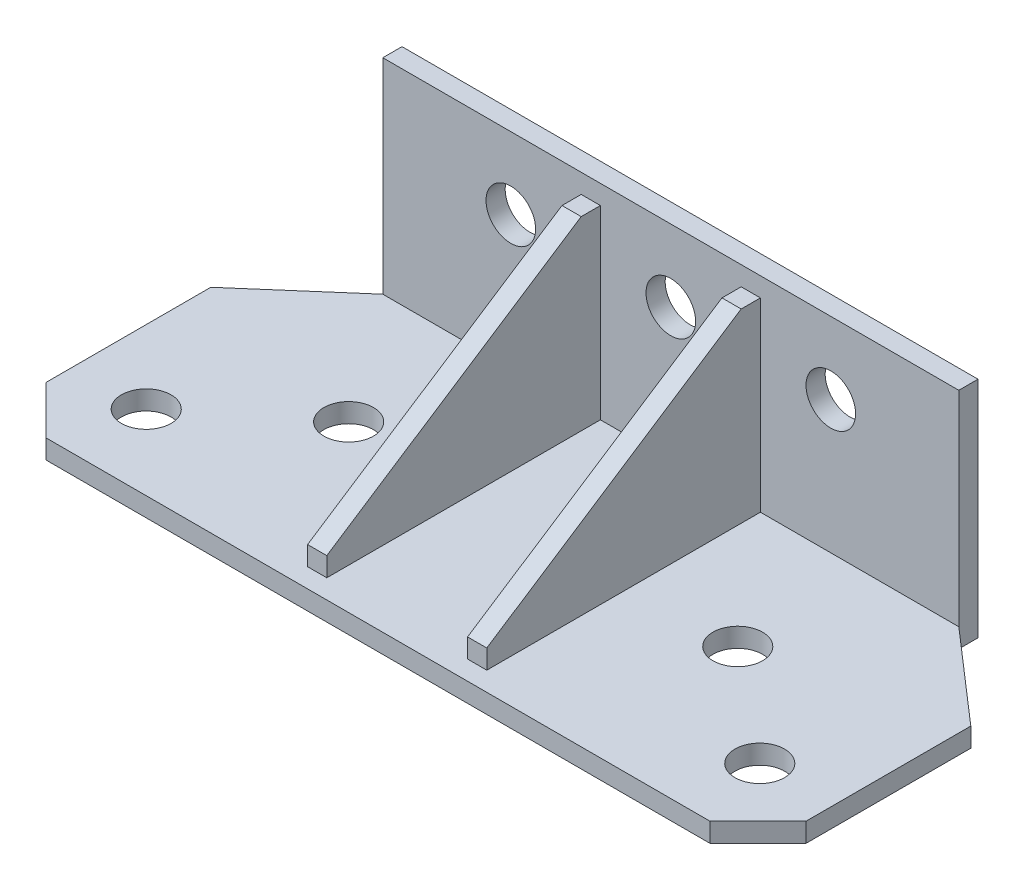
ISO-10303-21;
HEADER;
FILE_DESCRIPTION(('STEP AP214'),'2;1');
FILE_NAME('part.step','',(''),(''),'','','');
FILE_SCHEMA(('AUTOMOTIVE_DESIGN { 1 0 10303 214 1 1 1 1 }'));
ENDSEC;
DATA;
#1=APPLICATION_CONTEXT('core data for automotive mechanical design processes');
#2=APPLICATION_PROTOCOL_DEFINITION('international standard','automotive_design',2000,#1);
#3=PRODUCT_CONTEXT('',#1,'mechanical');
#4=PRODUCT('Part','Part','',(#3));
#5=PRODUCT_RELATED_PRODUCT_CATEGORY('part','',(#4));
#6=PRODUCT_DEFINITION_FORMATION('','',#4);
#7=PRODUCT_DEFINITION_CONTEXT('part definition',#1,'design');
#8=PRODUCT_DEFINITION('design','',#6,#7);
#9=PRODUCT_DEFINITION_SHAPE('','',#8);
#10=(LENGTH_UNIT() NAMED_UNIT(*) SI_UNIT(.MILLI.,.METRE.));
#11=(NAMED_UNIT(*) PLANE_ANGLE_UNIT() SI_UNIT($,.RADIAN.));
#12=(NAMED_UNIT(*) SI_UNIT($,.STERADIAN.) SOLID_ANGLE_UNIT());
#13=UNCERTAINTY_MEASURE_WITH_UNIT(LENGTH_MEASURE(1.E-05),#10,'distance_accuracy_value','');
#14=(GEOMETRIC_REPRESENTATION_CONTEXT(3) GLOBAL_UNCERTAINTY_ASSIGNED_CONTEXT((#13)) GLOBAL_UNIT_ASSIGNED_CONTEXT((#10,
#11,#12)) REPRESENTATION_CONTEXT('',''));
#15=CARTESIAN_POINT('',(0.,0.,0.));
#16=DIRECTION('',(0.,0.,1.));
#17=DIRECTION('',(1.,0.,0.));
#18=AXIS2_PLACEMENT_3D('',#15,#16,#17);
#19=CARTESIAN_POINT('',(-57.5,12.,195.));
#20=DIRECTION('',(0.,-1.,0.));
#21=DIRECTION('',(0.,0.,-1.));
#22=AXIS2_PLACEMENT_3D('',#19,#20,#21);
#23=PLANE('',#22);
#24=CARTESIAN_POINT('',(371.732317868824,12.,148.125657450823));
#25=DIRECTION('',(0.,1.,0.));
#26=DIRECTION('',(0.,0.,1.));
#27=AXIS2_PLACEMENT_3D('',#24,#25,#26);
#28=CIRCLE('',#27,15.5);
#29=CARTESIAN_POINT('',(371.732317868824,12.,163.625657450823));
#30=VERTEX_POINT('',#29);
#31=EDGE_CURVE('E209',#30,#30,#28,.T.);
#32=ORIENTED_EDGE('',*,*,#31,.F.);
#33=EDGE_LOOP('',(#32));
#34=FACE_BOUND('',#33,.T.);
#35=CARTESIAN_POINT('',(301.586347916815,12.,91.7382217980828));
#36=DIRECTION('',(0.,1.,0.));
#37=DIRECTION('',(0.,0.,1.));
#38=AXIS2_PLACEMENT_3D('',#35,#36,#37);
#39=CIRCLE('',#38,15.5);
#40=CARTESIAN_POINT('',(301.586347916815,12.,107.238221798083));
#41=VERTEX_POINT('',#40);
#42=EDGE_CURVE('E215',#41,#41,#39,.T.);
#43=ORIENTED_EDGE('',*,*,#42,.F.);
#44=EDGE_LOOP('',(#43));
#45=FACE_BOUND('',#44,.T.);
#46=CARTESIAN_POINT('',(58.4136520831852,12.,91.7382217980828));
#47=DIRECTION('',(0.,1.,0.));
#48=DIRECTION('',(0.,0.,1.));
#49=AXIS2_PLACEMENT_3D('',#46,#47,#48);
#50=CIRCLE('',#49,15.5);
#51=CARTESIAN_POINT('',(58.4136520831852,12.,107.238221798083));
#52=VERTEX_POINT('',#51);
#53=EDGE_CURVE('E227',#52,#52,#50,.F.);
#54=ORIENTED_EDGE('',*,*,#53,.T.);
#55=EDGE_LOOP('',(#54));
#56=FACE_BOUND('',#55,.T.);
#57=CARTESIAN_POINT('',(-11.7323178688235,12.,148.125657450823));
#58=DIRECTION('',(0.,1.,0.));
#59=DIRECTION('',(0.,0.,1.));
#60=AXIS2_PLACEMENT_3D('',#57,#58,#59);
#61=CIRCLE('',#60,15.5);
#62=CARTESIAN_POINT('',(-11.7323178688235,12.,163.625657450823));
#63=VERTEX_POINT('',#62);
#64=EDGE_CURVE('E221',#63,#63,#61,.F.);
#65=ORIENTED_EDGE('',*,*,#64,.T.);
#66=EDGE_LOOP('',(#65));
#67=FACE_BOUND('',#66,.T.);
#68=DIRECTION('',(0.,0.,-1.));
#69=VECTOR('',#68,1.);
#70=CARTESIAN_POINT('',(236.,11.9999999999999,183.));
#71=LINE('',#70,#69);
#72=CARTESIAN_POINT('',(236.,12.,183.));
#73=VERTEX_POINT('',#72);
#74=CARTESIAN_POINT('',(236.,12.,12.));
#75=VERTEX_POINT('',#74);
#76=EDGE_CURVE('E419',#73,#75,#71,.T.);
#77=ORIENTED_EDGE('',*,*,#76,.F.);
#78=DIRECTION('',(1.,0.,0.));
#79=VECTOR('',#78,1.);
#80=CARTESIAN_POINT('',(236.,11.9999999999999,183.));
#81=LINE('',#80,#79);
#82=CARTESIAN_POINT('',(224.,12.,183.));
#83=VERTEX_POINT('',#82);
#84=EDGE_CURVE('E413',#83,#73,#81,.T.);
#85=ORIENTED_EDGE('',*,*,#84,.F.);
#86=DIRECTION('',(0.,0.,-1.));
#87=VECTOR('',#86,1.);
#88=CARTESIAN_POINT('',(224.,12.,183.));
#89=LINE('',#88,#87);
#90=CARTESIAN_POINT('',(224.,12.,12.));
#91=VERTEX_POINT('',#90);
#92=EDGE_CURVE('E421',#83,#91,#89,.T.);
#93=ORIENTED_EDGE('',*,*,#92,.T.);
#94=DIRECTION('',(-1.,0.,0.));
#95=VECTOR('',#94,1.);
#96=CARTESIAN_POINT('',(-57.5,12.,12.));
#97=LINE('',#96,#95);
#98=CARTESIAN_POINT('',(136.,12.,12.));
#99=VERTEX_POINT('',#98);
#100=EDGE_CURVE('E275',#91,#99,#97,.T.);
#101=ORIENTED_EDGE('',*,*,#100,.T.);
#102=DIRECTION('',(0.,0.,-1.));
#103=VECTOR('',#102,1.);
#104=CARTESIAN_POINT('',(136.,12.,183.));
#105=LINE('',#104,#103);
#106=CARTESIAN_POINT('',(136.,12.,183.));
#107=VERTEX_POINT('',#106);
#108=EDGE_CURVE('E197',#107,#99,#105,.T.);
#109=ORIENTED_EDGE('',*,*,#108,.F.);
#110=DIRECTION('',(1.,0.,0.));
#111=VECTOR('',#110,1.);
#112=CARTESIAN_POINT('',(124.,12.,183.));
#113=LINE('',#112,#111);
#114=CARTESIAN_POINT('',(124.,12.,183.));
#115=VERTEX_POINT('',#114);
#116=EDGE_CURVE('E200',#115,#107,#113,.T.);
#117=ORIENTED_EDGE('',*,*,#116,.F.);
#118=DIRECTION('',(0.,0.,-1.));
#119=VECTOR('',#118,1.);
#120=CARTESIAN_POINT('',(124.,12.,183.));
#121=LINE('',#120,#119);
#122=CARTESIAN_POINT('',(124.,12.,12.));
#123=VERTEX_POINT('',#122);
#124=EDGE_CURVE('E207',#115,#123,#121,.T.);
#125=ORIENTED_EDGE('',*,*,#124,.T.);
#126=CARTESIAN_POINT('',(0.,12.,12.));
#127=VERTEX_POINT('',#126);
#128=EDGE_CURVE('E276',#123,#127,#97,.T.);
#129=ORIENTED_EDGE('',*,*,#128,.T.);
#130=DIRECTION('',(0.754605522163505,0.,-0.656178714924787));
#131=VECTOR('',#130,1.);
#132=CARTESIAN_POINT('',(5.94187298170075,12.,6.83315392895587));
#133=LINE('',#132,#131);
#134=CARTESIAN_POINT('',(-57.5,12.,62.));
#135=VERTEX_POINT('',#134);
#136=EDGE_CURVE('E233',#135,#127,#133,.T.);
#137=ORIENTED_EDGE('',*,*,#136,.F.);
#138=DIRECTION('',(0.,0.,-1.));
#139=VECTOR('',#138,1.);
#140=CARTESIAN_POINT('',(-57.5,12.,195.));
#141=LINE('',#140,#139);
#142=CARTESIAN_POINT('',(-57.5,12.,165.));
#143=VERTEX_POINT('',#142);
#144=EDGE_CURVE('E270',#143,#135,#141,.T.);
#145=ORIENTED_EDGE('',*,*,#144,.F.);
#146=DIRECTION('',(-0.707106781186548,0.,-0.707106781186548));
#147=VECTOR('',#146,1.);
#148=CARTESIAN_POINT('',(-111.25,12.,111.25));
#149=LINE('',#148,#147);
#150=CARTESIAN_POINT('',(-27.5,12.,195.));
#151=VERTEX_POINT('',#150);
#152=EDGE_CURVE('E239',#151,#143,#149,.T.);
#153=ORIENTED_EDGE('',*,*,#152,.F.);
#154=DIRECTION('',(-1.,0.,0.));
#155=VECTOR('',#154,1.);
#156=CARTESIAN_POINT('',(-57.5,12.,195.));
#157=LINE('',#156,#155);
#158=CARTESIAN_POINT('',(387.5,12.,195.));
#159=VERTEX_POINT('',#158);
#160=EDGE_CURVE('E267',#159,#151,#157,.T.);
#161=ORIENTED_EDGE('',*,*,#160,.F.);
#162=DIRECTION('',(0.707106781186548,0.,-0.707106781186547));
#163=VECTOR('',#162,1.);
#164=CARTESIAN_POINT('',(291.25,12.,291.25));
#165=LINE('',#164,#163);
#166=CARTESIAN_POINT('',(417.5,12.,165.));
#167=VERTEX_POINT('',#166);
#168=EDGE_CURVE('E248',#159,#167,#165,.T.);
#169=ORIENTED_EDGE('',*,*,#168,.T.);
#170=DIRECTION('',(0.,0.,-1.));
#171=VECTOR('',#170,1.);
#172=CARTESIAN_POINT('',(417.5,12.,195.));
#173=LINE('',#172,#171);
#174=CARTESIAN_POINT('',(417.5,12.,62.));
#175=VERTEX_POINT('',#174);
#176=EDGE_CURVE('E279',#167,#175,#173,.T.);
#177=ORIENTED_EDGE('',*,*,#176,.T.);
#178=DIRECTION('',(-0.754605522163505,0.,-0.656178714924787));
#179=VECTOR('',#178,1.);
#180=CARTESIAN_POINT('',(149.063509149623,12.,-171.423035522067));
#181=LINE('',#180,#179);
#182=CARTESIAN_POINT('',(360.,12.,12.));
#183=VERTEX_POINT('',#182);
#184=EDGE_CURVE('E255',#175,#183,#181,.T.);
#185=ORIENTED_EDGE('',*,*,#184,.T.);
#186=EDGE_CURVE('E271',#183,#75,#97,.T.);
#187=ORIENTED_EDGE('',*,*,#186,.T.);
#188=EDGE_LOOP('',(#77,#85,#93,#101,#109,#117,#125,#129,#137,#145,#153,#161,#169,#177,#185,#187));
#189=FACE_BOUND('',#188,.T.);
#190=ADVANCED_FACE('F32',(#34,#45,#56,#67,#189),#23,.F.);
#191=CARTESIAN_POINT('',(0.,140.,12.));
#192=DIRECTION('',(0.,0.,-1.));
#193=DIRECTION('',(-1.,0.,0.));
#194=AXIS2_PLACEMENT_3D('',#191,#192,#193);
#195=PLANE('',#194);
#196=CARTESIAN_POINT('',(280.,95.,12.));
#197=DIRECTION('',(0.,0.,1.));
#198=DIRECTION('',(1.,0.,0.));
#199=AXIS2_PLACEMENT_3D('',#196,#197,#198);
#200=CIRCLE('',#199,15.5);
#201=CARTESIAN_POINT('',(295.5,95.,12.));
#202=VERTEX_POINT('',#201);
#203=EDGE_CURVE('E287',#202,#202,#200,.T.);
#204=ORIENTED_EDGE('',*,*,#203,.F.);
#205=EDGE_LOOP('',(#204));
#206=FACE_BOUND('',#205,.T.);
#207=CARTESIAN_POINT('',(80.,95.,12.));
#208=DIRECTION('',(0.,0.,1.));
#209=DIRECTION('',(1.,0.,0.));
#210=AXIS2_PLACEMENT_3D('',#207,#208,#209);
#211=CIRCLE('',#210,15.5);
#212=CARTESIAN_POINT('',(95.5,95.,12.));
#213=VERTEX_POINT('',#212);
#214=EDGE_CURVE('E299',#213,#213,#211,.T.);
#215=ORIENTED_EDGE('',*,*,#214,.F.);
#216=EDGE_LOOP('',(#215));
#217=FACE_BOUND('',#216,.T.);
#218=CARTESIAN_POINT('',(180.,95.,12.));
#219=DIRECTION('',(0.,0.,1.));
#220=DIRECTION('',(1.,0.,0.));
#221=AXIS2_PLACEMENT_3D('',#218,#219,#220);
#222=CIRCLE('',#221,15.5);
#223=CARTESIAN_POINT('',(195.5,95.,12.));
#224=VERTEX_POINT('',#223);
#225=EDGE_CURVE('E293',#224,#224,#222,.T.);
#226=ORIENTED_EDGE('',*,*,#225,.F.);
#227=EDGE_LOOP('',(#226));
#228=FACE_BOUND('',#227,.T.);
#229=DIRECTION('',(0.,1.,0.));
#230=VECTOR('',#229,1.);
#231=CARTESIAN_POINT('',(236.,128.,12.));
#232=LINE('',#231,#230);
#233=CARTESIAN_POINT('',(236.,128.,12.));
#234=VERTEX_POINT('',#233);
#235=EDGE_CURVE('E401',#75,#234,#232,.T.);
#236=ORIENTED_EDGE('',*,*,#235,.F.);
#237=ORIENTED_EDGE('',*,*,#186,.F.);
#238=DIRECTION('',(0.,1.,0.));
#239=VECTOR('',#238,1.);
#240=CARTESIAN_POINT('',(360.,0.,12.));
#241=LINE('',#240,#239);
#242=CARTESIAN_POINT('',(360.,140.,12.));
#243=VERTEX_POINT('',#242);
#244=EDGE_CURVE('E309',#183,#243,#241,.T.);
#245=ORIENTED_EDGE('',*,*,#244,.T.);
#246=DIRECTION('',(-1.,0.,0.));
#247=VECTOR('',#246,1.);
#248=CARTESIAN_POINT('',(0.,140.,12.));
#249=LINE('',#248,#247);
#250=CARTESIAN_POINT('',(0.,140.,12.));
#251=VERTEX_POINT('',#250);
#252=EDGE_CURVE('E359',#243,#251,#249,.T.);
#253=ORIENTED_EDGE('',*,*,#252,.T.);
#254=DIRECTION('',(0.,-1.,0.));
#255=VECTOR('',#254,1.);
#256=CARTESIAN_POINT('',(0.,0.,12.));
#257=LINE('',#256,#255);
#258=EDGE_CURVE('E305',#251,#127,#257,.T.);
#259=ORIENTED_EDGE('',*,*,#258,.T.);
#260=ORIENTED_EDGE('',*,*,#128,.F.);
#261=DIRECTION('',(0.,-1.,0.));
#262=VECTOR('',#261,1.);
#263=CARTESIAN_POINT('',(124.,128.,12.));
#264=LINE('',#263,#262);
#265=CARTESIAN_POINT('',(124.,128.,12.));
#266=VERTEX_POINT('',#265);
#267=EDGE_CURVE('E428',#266,#123,#264,.T.);
#268=ORIENTED_EDGE('',*,*,#267,.F.);
#269=DIRECTION('',(-1.,0.,0.));
#270=VECTOR('',#269,1.);
#271=CARTESIAN_POINT('',(124.,128.,12.));
#272=LINE('',#271,#270);
#273=CARTESIAN_POINT('',(136.,128.,12.));
#274=VERTEX_POINT('',#273);
#275=EDGE_CURVE('E193',#274,#266,#272,.T.);
#276=ORIENTED_EDGE('',*,*,#275,.F.);
#277=DIRECTION('',(0.,1.,0.));
#278=VECTOR('',#277,1.);
#279=CARTESIAN_POINT('',(136.,128.,12.));
#280=LINE('',#279,#278);
#281=EDGE_CURVE('E432',#99,#274,#280,.T.);
#282=ORIENTED_EDGE('',*,*,#281,.F.);
#283=ORIENTED_EDGE('',*,*,#100,.F.);
#284=DIRECTION('',(0.,-1.,0.));
#285=VECTOR('',#284,1.);
#286=CARTESIAN_POINT('',(224.,128.,12.));
#287=LINE('',#286,#285);
#288=CARTESIAN_POINT('',(224.,128.,12.));
#289=VERTEX_POINT('',#288);
#290=EDGE_CURVE('E408',#289,#91,#287,.T.);
#291=ORIENTED_EDGE('',*,*,#290,.F.);
#292=DIRECTION('',(-1.,0.,0.));
#293=VECTOR('',#292,1.);
#294=CARTESIAN_POINT('',(236.,128.,12.));
#295=LINE('',#294,#293);
#296=EDGE_CURVE('E404',#234,#289,#295,.T.);
#297=ORIENTED_EDGE('',*,*,#296,.F.);
#298=EDGE_LOOP('',(#236,#237,#245,#253,#259,#260,#268,#276,#282,#283,#291,#297));
#299=FACE_BOUND('',#298,.T.);
#300=ADVANCED_FACE('F357',(#206,#217,#228,#299),#195,.F.);
#301=CARTESIAN_POINT('',(0.,0.,12.));
#302=DIRECTION('',(0.,1.,0.));
#303=DIRECTION('',(0.,0.,1.));
#304=AXIS2_PLACEMENT_3D('',#301,#302,#303);
#305=PLANE('',#304);
#306=CARTESIAN_POINT('',(371.732317868824,0.,148.125657450823));
#307=DIRECTION('',(0.,1.,0.));
#308=DIRECTION('',(0.,0.,1.));
#309=AXIS2_PLACEMENT_3D('',#306,#307,#308);
#310=CIRCLE('',#309,15.5);
#311=CARTESIAN_POINT('',(371.732317868824,0.,163.625657450823));
#312=VERTEX_POINT('',#311);
#313=EDGE_CURVE('E212',#312,#312,#310,.T.);
#314=ORIENTED_EDGE('',*,*,#313,.T.);
#315=EDGE_LOOP('',(#314));
#316=FACE_BOUND('',#315,.T.);
#317=CARTESIAN_POINT('',(301.586347916815,0.,91.7382217980828));
#318=DIRECTION('',(0.,1.,0.));
#319=DIRECTION('',(0.,0.,1.));
#320=AXIS2_PLACEMENT_3D('',#317,#318,#319);
#321=CIRCLE('',#320,15.5);
#322=CARTESIAN_POINT('',(301.586347916815,0.,107.238221798083));
#323=VERTEX_POINT('',#322);
#324=EDGE_CURVE('E218',#323,#323,#321,.T.);
#325=ORIENTED_EDGE('',*,*,#324,.T.);
#326=EDGE_LOOP('',(#325));
#327=FACE_BOUND('',#326,.T.);
#328=CARTESIAN_POINT('',(58.4136520831852,0.,91.7382217980828));
#329=DIRECTION('',(0.,1.,0.));
#330=DIRECTION('',(0.,0.,1.));
#331=AXIS2_PLACEMENT_3D('',#328,#329,#330);
#332=CIRCLE('',#331,15.5);
#333=CARTESIAN_POINT('',(58.4136520831852,0.,107.238221798083));
#334=VERTEX_POINT('',#333);
#335=EDGE_CURVE('E230',#334,#334,#332,.F.);
#336=ORIENTED_EDGE('',*,*,#335,.F.);
#337=EDGE_LOOP('',(#336));
#338=FACE_BOUND('',#337,.T.);
#339=DIRECTION('',(0.,0.,-1.));
#340=VECTOR('',#339,1.);
#341=CARTESIAN_POINT('',(-57.5,0.,195.));
#342=LINE('',#341,#340);
#343=CARTESIAN_POINT('',(-57.5,0.,165.));
#344=VERTEX_POINT('',#343);
#345=CARTESIAN_POINT('',(-57.5,0.,62.));
#346=VERTEX_POINT('',#345);
#347=EDGE_CURVE('E283',#344,#346,#342,.T.);
#348=ORIENTED_EDGE('',*,*,#347,.T.);
#349=DIRECTION('',(0.754605522163505,0.,-0.656178714924787));
#350=VECTOR('',#349,1.);
#351=CARTESIAN_POINT('',(0.,0.,12.));
#352=LINE('',#351,#350);
#353=CARTESIAN_POINT('',(0.,0.,12.));
#354=VERTEX_POINT('',#353);
#355=EDGE_CURVE('E236',#346,#354,#352,.T.);
#356=ORIENTED_EDGE('',*,*,#355,.T.);
#357=DIRECTION('',(0.,0.,-1.));
#358=VECTOR('',#357,1.);
#359=CARTESIAN_POINT('',(0.,0.,12.));
#360=LINE('',#359,#358);
#361=CARTESIAN_POINT('',(0.,0.,0.));
#362=VERTEX_POINT('',#361);
#363=EDGE_CURVE('E319',#354,#362,#360,.T.);
#364=ORIENTED_EDGE('',*,*,#363,.T.);
#365=DIRECTION('',(1.,0.,0.));
#366=VECTOR('',#365,1.);
#367=CARTESIAN_POINT('',(0.,0.,0.));
#368=LINE('',#367,#366);
#369=CARTESIAN_POINT('',(360.,0.,0.));
#370=VERTEX_POINT('',#369);
#371=EDGE_CURVE('E366',#362,#370,#368,.T.);
#372=ORIENTED_EDGE('',*,*,#371,.T.);
#373=DIRECTION('',(0.,0.,-1.));
#374=VECTOR('',#373,1.);
#375=CARTESIAN_POINT('',(360.,0.,12.));
#376=LINE('',#375,#374);
#377=CARTESIAN_POINT('',(360.,0.,12.));
#378=VERTEX_POINT('',#377);
#379=EDGE_CURVE('E322',#378,#370,#376,.T.);
#380=ORIENTED_EDGE('',*,*,#379,.F.);
#381=DIRECTION('',(-0.754605522163505,0.,-0.656178714924787));
#382=VECTOR('',#381,1.);
#383=CARTESIAN_POINT('',(155.005382131324,0.,-166.256189451023));
#384=LINE('',#383,#382);
#385=CARTESIAN_POINT('',(417.5,0.,62.));
#386=VERTEX_POINT('',#385);
#387=EDGE_CURVE('E261',#386,#378,#384,.T.);
#388=ORIENTED_EDGE('',*,*,#387,.F.);
#389=DIRECTION('',(0.,0.,-1.));
#390=VECTOR('',#389,1.);
#391=CARTESIAN_POINT('',(417.5,0.,195.));
#392=LINE('',#391,#390);
#393=CARTESIAN_POINT('',(417.5,0.,165.));
#394=VERTEX_POINT('',#393);
#395=EDGE_CURVE('E281',#394,#386,#392,.T.);
#396=ORIENTED_EDGE('',*,*,#395,.F.);
#397=DIRECTION('',(0.707106781186548,0.,-0.707106781186547));
#398=VECTOR('',#397,1.);
#399=CARTESIAN_POINT('',(285.25,0.,297.25));
#400=LINE('',#399,#398);
#401=CARTESIAN_POINT('',(387.5,0.,195.));
#402=VERTEX_POINT('',#401);
#403=EDGE_CURVE('E253',#402,#394,#400,.T.);
#404=ORIENTED_EDGE('',*,*,#403,.F.);
#405=DIRECTION('',(1.,0.,0.));
#406=VECTOR('',#405,1.);
#407=CARTESIAN_POINT('',(-57.5,0.,195.));
#408=LINE('',#407,#406);
#409=CARTESIAN_POINT('',(-27.5,0.,195.));
#410=VERTEX_POINT('',#409);
#411=EDGE_CURVE('E263',#410,#402,#408,.T.);
#412=ORIENTED_EDGE('',*,*,#411,.F.);
#413=DIRECTION('',(-0.707106781186548,0.,-0.707106781186548));
#414=VECTOR('',#413,1.);
#415=CARTESIAN_POINT('',(-105.25,0.,117.25));
#416=LINE('',#415,#414);
#417=EDGE_CURVE('E245',#410,#344,#416,.T.);
#418=ORIENTED_EDGE('',*,*,#417,.T.);
#419=EDGE_LOOP('',(#348,#356,#364,#372,#380,#388,#396,#404,#412,#418));
#420=FACE_BOUND('',#419,.T.);
#421=CARTESIAN_POINT('',(-11.7323178688235,0.,148.125657450823));
#422=DIRECTION('',(0.,1.,0.));
#423=DIRECTION('',(0.,0.,1.));
#424=AXIS2_PLACEMENT_3D('',#421,#422,#423);
#425=CIRCLE('',#424,15.5);
#426=CARTESIAN_POINT('',(-11.7323178688235,0.,163.625657450823));
#427=VERTEX_POINT('',#426);
#428=EDGE_CURVE('E224',#427,#427,#425,.F.);
#429=ORIENTED_EDGE('',*,*,#428,.F.);
#430=EDGE_LOOP('',(#429));
#431=FACE_BOUND('',#430,.T.);
#432=ADVANCED_FACE('F337',(#316,#327,#338,#420,#431),#305,.F.);
#433=CARTESIAN_POINT('',(417.5,12.,195.));
#434=DIRECTION('',(-1.,0.,0.));
#435=DIRECTION('',(0.,0.,1.));
#436=AXIS2_PLACEMENT_3D('',#433,#434,#435);
#437=PLANE('',#436);
#438=DIRECTION('',(0.,1.,0.));
#439=VECTOR('',#438,1.);
#440=CARTESIAN_POINT('',(417.5,-171.,165.));
#441=LINE('',#440,#439);
#442=EDGE_CURVE('E251',#394,#167,#441,.T.);
#443=ORIENTED_EDGE('',*,*,#442,.F.);
#444=ORIENTED_EDGE('',*,*,#395,.T.);
#445=DIRECTION('',(0.,1.,0.));
#446=VECTOR('',#445,1.);
#447=CARTESIAN_POINT('',(417.5,-171.,62.));
#448=LINE('',#447,#446);
#449=EDGE_CURVE('E258',#386,#175,#448,.T.);
#450=ORIENTED_EDGE('',*,*,#449,.T.);
#451=ORIENTED_EDGE('',*,*,#176,.F.);
#452=EDGE_LOOP('',(#443,#444,#450,#451));
#453=FACE_BOUND('',#452,.T.);
#454=ADVANCED_FACE('F485',(#453),#437,.F.);
#455=CARTESIAN_POINT('',(-57.5,0.,195.));
#456=DIRECTION('',(0.,0.,1.));
#457=DIRECTION('',(1.,0.,0.));
#458=AXIS2_PLACEMENT_3D('',#455,#456,#457);
#459=PLANE('',#458);
#460=DIRECTION('',(0.,1.,0.));
#461=VECTOR('',#460,1.);
#462=CARTESIAN_POINT('',(-27.5,-171.,195.));
#463=LINE('',#462,#461);
#464=EDGE_CURVE('E243',#410,#151,#463,.T.);
#465=ORIENTED_EDGE('',*,*,#464,.F.);
#466=ORIENTED_EDGE('',*,*,#411,.T.);
#467=DIRECTION('',(0.,1.,0.));
#468=VECTOR('',#467,1.);
#469=CARTESIAN_POINT('',(387.5,0.,195.));
#470=LINE('',#469,#468);
#471=EDGE_CURVE('E274',#402,#159,#470,.T.);
#472=ORIENTED_EDGE('',*,*,#471,.T.);
#473=ORIENTED_EDGE('',*,*,#160,.T.);
#474=EDGE_LOOP('',(#465,#466,#472,#473));
#475=FACE_BOUND('',#474,.T.);
#476=ADVANCED_FACE('F347',(#475),#459,.T.);
#477=CARTESIAN_POINT('',(0.,140.,0.));
#478=DIRECTION('',(0.,0.,-1.));
#479=DIRECTION('',(-1.,0.,0.));
#480=AXIS2_PLACEMENT_3D('',#477,#478,#479);
#481=PLANE('',#480);
#482=CARTESIAN_POINT('',(180.,95.,0.));
#483=DIRECTION('',(0.,0.,1.));
#484=DIRECTION('',(1.,0.,0.));
#485=AXIS2_PLACEMENT_3D('',#482,#483,#484);
#486=CIRCLE('',#485,15.5);
#487=CARTESIAN_POINT('',(195.5,95.,0.));
#488=VERTEX_POINT('',#487);
#489=EDGE_CURVE('E290',#488,#488,#486,.T.);
#490=ORIENTED_EDGE('',*,*,#489,.T.);
#491=EDGE_LOOP('',(#490));
#492=FACE_BOUND('',#491,.T.);
#493=DIRECTION('',(0.,-1.,0.));
#494=VECTOR('',#493,1.);
#495=CARTESIAN_POINT('',(0.,0.,0.));
#496=LINE('',#495,#494);
#497=CARTESIAN_POINT('',(0.,140.,0.));
#498=VERTEX_POINT('',#497);
#499=EDGE_CURVE('E302',#498,#362,#496,.T.);
#500=ORIENTED_EDGE('',*,*,#499,.F.);
#501=DIRECTION('',(-1.,0.,0.));
#502=VECTOR('',#501,1.);
#503=CARTESIAN_POINT('',(0.,140.,0.));
#504=LINE('',#503,#502);
#505=CARTESIAN_POINT('',(360.,140.,0.));
#506=VERTEX_POINT('',#505);
#507=EDGE_CURVE('E316',#506,#498,#504,.T.);
#508=ORIENTED_EDGE('',*,*,#507,.F.);
#509=DIRECTION('',(0.,1.,0.));
#510=VECTOR('',#509,1.);
#511=CARTESIAN_POINT('',(360.,0.,0.));
#512=LINE('',#511,#510);
#513=EDGE_CURVE('E372',#370,#506,#512,.T.);
#514=ORIENTED_EDGE('',*,*,#513,.F.);
#515=ORIENTED_EDGE('',*,*,#371,.F.);
#516=EDGE_LOOP('',(#500,#508,#514,#515));
#517=FACE_BOUND('',#516,.T.);
#518=CARTESIAN_POINT('',(80.,95.,0.));
#519=DIRECTION('',(0.,0.,1.));
#520=DIRECTION('',(1.,0.,0.));
#521=AXIS2_PLACEMENT_3D('',#518,#519,#520);
#522=CIRCLE('',#521,15.5);
#523=CARTESIAN_POINT('',(95.5,95.,0.));
#524=VERTEX_POINT('',#523);
#525=EDGE_CURVE('E296',#524,#524,#522,.T.);
#526=ORIENTED_EDGE('',*,*,#525,.T.);
#527=EDGE_LOOP('',(#526));
#528=FACE_BOUND('',#527,.T.);
#529=CARTESIAN_POINT('',(280.,95.,0.));
#530=DIRECTION('',(0.,0.,1.));
#531=DIRECTION('',(1.,0.,0.));
#532=AXIS2_PLACEMENT_3D('',#529,#530,#531);
#533=CIRCLE('',#532,15.5);
#534=CARTESIAN_POINT('',(295.5,95.,0.));
#535=VERTEX_POINT('',#534);
#536=EDGE_CURVE('E286',#535,#535,#533,.T.);
#537=ORIENTED_EDGE('',*,*,#536,.T.);
#538=EDGE_LOOP('',(#537));
#539=FACE_BOUND('',#538,.T.);
#540=ADVANCED_FACE('F382',(#492,#517,#528,#539),#481,.T.);
#541=CARTESIAN_POINT('',(0.,0.,12.));
#542=DIRECTION('',(1.,0.,0.));
#543=DIRECTION('',(0.,0.,-1.));
#544=AXIS2_PLACEMENT_3D('',#541,#542,#543);
#545=PLANE('',#544);
#546=ORIENTED_EDGE('',*,*,#499,.T.);
#547=ORIENTED_EDGE('',*,*,#363,.F.);
#548=EDGE_CURVE('E310',#127,#354,#257,.T.);
#549=ORIENTED_EDGE('',*,*,#548,.F.);
#550=ORIENTED_EDGE('',*,*,#258,.F.);
#551=DIRECTION('',(0.,0.,-1.));
#552=VECTOR('',#551,1.);
#553=CARTESIAN_POINT('',(0.,140.,12.));
#554=LINE('',#553,#552);
#555=EDGE_CURVE('E388',#251,#498,#554,.T.);
#556=ORIENTED_EDGE('',*,*,#555,.T.);
#557=EDGE_LOOP('',(#546,#547,#549,#550,#556));
#558=FACE_BOUND('',#557,.T.);
#559=ADVANCED_FACE('F34',(#558),#545,.F.);
#560=CARTESIAN_POINT('',(360.,0.,12.));
#561=DIRECTION('',(-1.,0.,0.));
#562=DIRECTION('',(0.,0.,1.));
#563=AXIS2_PLACEMENT_3D('',#560,#561,#562);
#564=PLANE('',#563);
#565=ORIENTED_EDGE('',*,*,#513,.T.);
#566=DIRECTION('',(0.,0.,-1.));
#567=VECTOR('',#566,1.);
#568=CARTESIAN_POINT('',(360.,140.,12.));
#569=LINE('',#568,#567);
#570=EDGE_CURVE('E379',#243,#506,#569,.T.);
#571=ORIENTED_EDGE('',*,*,#570,.F.);
#572=ORIENTED_EDGE('',*,*,#244,.F.);
#573=EDGE_CURVE('E317',#378,#183,#241,.T.);
#574=ORIENTED_EDGE('',*,*,#573,.F.);
#575=ORIENTED_EDGE('',*,*,#379,.T.);
#576=EDGE_LOOP('',(#565,#571,#572,#574,#575));
#577=FACE_BOUND('',#576,.T.);
#578=ADVANCED_FACE('F375',(#577),#564,.F.);
#579=CARTESIAN_POINT('',(0.,140.,12.));
#580=DIRECTION('',(0.,-1.,0.));
#581=DIRECTION('',(0.,0.,-1.));
#582=AXIS2_PLACEMENT_3D('',#579,#580,#581);
#583=PLANE('',#582);
#584=ORIENTED_EDGE('',*,*,#507,.T.);
#585=ORIENTED_EDGE('',*,*,#555,.F.);
#586=ORIENTED_EDGE('',*,*,#252,.F.);
#587=ORIENTED_EDGE('',*,*,#570,.T.);
#588=EDGE_LOOP('',(#584,#585,#586,#587));
#589=FACE_BOUND('',#588,.T.);
#590=ADVANCED_FACE('F392',(#589),#583,.F.);
#591=CARTESIAN_POINT('',(80.,95.,12.));
#592=DIRECTION('',(0.,0.,-1.));
#593=DIRECTION('',(-1.,0.,0.));
#594=AXIS2_PLACEMENT_3D('',#591,#592,#593);
#595=CYLINDRICAL_SURFACE('',#594,15.5);
#596=ORIENTED_EDGE('',*,*,#214,.T.);
#597=EDGE_LOOP('',(#596));
#598=FACE_BOUND('',#597,.T.);
#599=ORIENTED_EDGE('',*,*,#525,.F.);
#600=EDGE_LOOP('',(#599));
#601=FACE_BOUND('',#600,.T.);
#602=ADVANCED_FACE('F498',(#598,#601),#595,.F.);
#603=CARTESIAN_POINT('',(180.,95.,12.));
#604=DIRECTION('',(0.,0.,-1.));
#605=DIRECTION('',(-1.,0.,0.));
#606=AXIS2_PLACEMENT_3D('',#603,#604,#605);
#607=CYLINDRICAL_SURFACE('',#606,15.5);
#608=ORIENTED_EDGE('',*,*,#225,.T.);
#609=EDGE_LOOP('',(#608));
#610=FACE_BOUND('',#609,.T.);
#611=ORIENTED_EDGE('',*,*,#489,.F.);
#612=EDGE_LOOP('',(#611));
#613=FACE_BOUND('',#612,.T.);
#614=ADVANCED_FACE('F494',(#610,#613),#607,.F.);
#615=CARTESIAN_POINT('',(280.,95.,12.));
#616=DIRECTION('',(0.,0.,-1.));
#617=DIRECTION('',(-1.,0.,0.));
#618=AXIS2_PLACEMENT_3D('',#615,#616,#617);
#619=CYLINDRICAL_SURFACE('',#618,15.5);
#620=ORIENTED_EDGE('',*,*,#203,.T.);
#621=EDGE_LOOP('',(#620));
#622=FACE_BOUND('',#621,.T.);
#623=ORIENTED_EDGE('',*,*,#536,.F.);
#624=EDGE_LOOP('',(#623));
#625=FACE_BOUND('',#624,.T.);
#626=ADVANCED_FACE('F491',(#622,#625),#619,.F.);
#627=CARTESIAN_POINT('',(-57.5,12.,195.));
#628=DIRECTION('',(1.,0.,0.));
#629=DIRECTION('',(0.,0.,-1.));
#630=AXIS2_PLACEMENT_3D('',#627,#628,#629);
#631=PLANE('',#630);
#632=ORIENTED_EDGE('',*,*,#144,.T.);
#633=DIRECTION('',(0.,-1.,0.));
#634=VECTOR('',#633,1.);
#635=CARTESIAN_POINT('',(-57.5,12.,62.));
#636=LINE('',#635,#634);
#637=EDGE_CURVE('E40',#135,#346,#636,.T.);
#638=ORIENTED_EDGE('',*,*,#637,.T.);
#639=ORIENTED_EDGE('',*,*,#347,.F.);
#640=DIRECTION('',(0.,1.,0.));
#641=VECTOR('',#640,1.);
#642=CARTESIAN_POINT('',(-57.5,12.,165.));
#643=LINE('',#642,#641);
#644=EDGE_CURVE('E327',#344,#143,#643,.T.);
#645=ORIENTED_EDGE('',*,*,#644,.T.);
#646=EDGE_LOOP('',(#632,#638,#639,#645));
#647=FACE_BOUND('',#646,.T.);
#648=ADVANCED_FACE('F332',(#647),#631,.F.);
#649=CARTESIAN_POINT('',(149.063509149623,-171.,-171.423035522067));
#650=DIRECTION('',(0.656178714924787,0.,-0.754605522163505));
#651=DIRECTION('',(-0.754605522163505,0.,-0.656178714924787));
#652=AXIS2_PLACEMENT_3D('',#649,#650,#651);
#653=PLANE('',#652);
#654=ORIENTED_EDGE('',*,*,#387,.T.);
#655=ORIENTED_EDGE('',*,*,#573,.T.);
#656=ORIENTED_EDGE('',*,*,#184,.F.);
#657=ORIENTED_EDGE('',*,*,#449,.F.);
#658=EDGE_LOOP('',(#654,#655,#656,#657));
#659=FACE_BOUND('',#658,.T.);
#660=ADVANCED_FACE('F396',(#659),#653,.T.);
#661=CARTESIAN_POINT('',(291.25,-171.,291.25));
#662=DIRECTION('',(0.707106781186547,0.,0.707106781186548));
#663=DIRECTION('',(0.707106781186548,0.,-0.707106781186547));
#664=AXIS2_PLACEMENT_3D('',#661,#662,#663);
#665=PLANE('',#664);
#666=ORIENTED_EDGE('',*,*,#403,.T.);
#667=ORIENTED_EDGE('',*,*,#442,.T.);
#668=ORIENTED_EDGE('',*,*,#168,.F.);
#669=ORIENTED_EDGE('',*,*,#471,.F.);
#670=EDGE_LOOP('',(#666,#667,#668,#669));
#671=FACE_BOUND('',#670,.T.);
#672=ADVANCED_FACE('F537',(#671),#665,.T.);
#673=CARTESIAN_POINT('',(-111.25,-171.,111.25));
#674=DIRECTION('',(0.707106781186547,0.,-0.707106781186547));
#675=DIRECTION('',(-0.707106781186548,0.,-0.707106781186548));
#676=AXIS2_PLACEMENT_3D('',#673,#674,#675);
#677=PLANE('',#676);
#678=ORIENTED_EDGE('',*,*,#464,.T.);
#679=ORIENTED_EDGE('',*,*,#152,.T.);
#680=ORIENTED_EDGE('',*,*,#644,.F.);
#681=ORIENTED_EDGE('',*,*,#417,.F.);
#682=EDGE_LOOP('',(#678,#679,#680,#681));
#683=FACE_BOUND('',#682,.T.);
#684=ADVANCED_FACE('F344',(#683),#677,.F.);
#685=CARTESIAN_POINT('',(5.94187298170075,-171.,6.83315392895587));
#686=DIRECTION('',(0.656178714924787,0.,0.754605522163505));
#687=DIRECTION('',(0.754605522163505,0.,-0.656178714924787));
#688=AXIS2_PLACEMENT_3D('',#685,#686,#687);
#689=PLANE('',#688);
#690=ORIENTED_EDGE('',*,*,#637,.F.);
#691=ORIENTED_EDGE('',*,*,#136,.T.);
#692=ORIENTED_EDGE('',*,*,#548,.T.);
#693=ORIENTED_EDGE('',*,*,#355,.F.);
#694=EDGE_LOOP('',(#690,#691,#692,#693));
#695=FACE_BOUND('',#694,.T.);
#696=ADVANCED_FACE('F353',(#695),#689,.F.);
#697=CARTESIAN_POINT('',(58.4136520831852,-171.,91.7382217980828));
#698=DIRECTION('',(0.,1.,0.));
#699=DIRECTION('',(0.,0.,1.));
#700=AXIS2_PLACEMENT_3D('',#697,#698,#699);
#701=CYLINDRICAL_SURFACE('',#700,15.5);
#702=ORIENTED_EDGE('',*,*,#53,.F.);
#703=EDGE_LOOP('',(#702));
#704=FACE_BOUND('',#703,.T.);
#705=ORIENTED_EDGE('',*,*,#335,.T.);
#706=EDGE_LOOP('',(#705));
#707=FACE_BOUND('',#706,.T.);
#708=ADVANCED_FACE('F519',(#704,#707),#701,.F.);
#709=CARTESIAN_POINT('',(-11.7323178688235,-171.,148.125657450823));
#710=DIRECTION('',(0.,1.,0.));
#711=DIRECTION('',(0.,0.,1.));
#712=AXIS2_PLACEMENT_3D('',#709,#710,#711);
#713=CYLINDRICAL_SURFACE('',#712,15.5);
#714=ORIENTED_EDGE('',*,*,#64,.F.);
#715=EDGE_LOOP('',(#714));
#716=FACE_BOUND('',#715,.T.);
#717=ORIENTED_EDGE('',*,*,#428,.T.);
#718=EDGE_LOOP('',(#717));
#719=FACE_BOUND('',#718,.T.);
#720=ADVANCED_FACE('F521',(#716,#719),#713,.F.);
#721=CARTESIAN_POINT('',(301.586347916815,-171.,91.7382217980828));
#722=DIRECTION('',(0.,1.,0.));
#723=DIRECTION('',(0.,0.,1.));
#724=AXIS2_PLACEMENT_3D('',#721,#722,#723);
#725=CYLINDRICAL_SURFACE('',#724,15.5);
#726=ORIENTED_EDGE('',*,*,#42,.T.);
#727=EDGE_LOOP('',(#726));
#728=FACE_BOUND('',#727,.T.);
#729=ORIENTED_EDGE('',*,*,#324,.F.);
#730=EDGE_LOOP('',(#729));
#731=FACE_BOUND('',#730,.T.);
#732=ADVANCED_FACE('F528',(#728,#731),#725,.F.);
#733=CARTESIAN_POINT('',(371.732317868824,-171.,148.125657450823));
#734=DIRECTION('',(0.,1.,0.));
#735=DIRECTION('',(0.,0.,1.));
#736=AXIS2_PLACEMENT_3D('',#733,#734,#735);
#737=CYLINDRICAL_SURFACE('',#736,15.5);
#738=ORIENTED_EDGE('',*,*,#31,.T.);
#739=EDGE_LOOP('',(#738));
#740=FACE_BOUND('',#739,.T.);
#741=ORIENTED_EDGE('',*,*,#313,.F.);
#742=EDGE_LOOP('',(#741));
#743=FACE_BOUND('',#742,.T.);
#744=ADVANCED_FACE('F576',(#740,#743),#737,.F.);
#745=CARTESIAN_POINT('',(124.,128.,183.));
#746=DIRECTION('',(1.,0.,0.));
#747=DIRECTION('',(0.,1.,0.));
#748=AXIS2_PLACEMENT_3D('',#745,#746,#747);
#749=PLANE('',#748);
#750=DIRECTION('',(0.,-1.,0.));
#751=VECTOR('',#750,1.);
#752=CARTESIAN_POINT('',(124.,128.,183.));
#753=LINE('',#752,#751);
#754=CARTESIAN_POINT('',(124.,24.,183.));
#755=VERTEX_POINT('',#754);
#756=EDGE_CURVE('E188',#755,#115,#753,.T.);
#757=ORIENTED_EDGE('',*,*,#756,.F.);
#758=DIRECTION('',(0.,-0.547391166310492,0.836876879263156));
#759=VECTOR('',#758,1.);
#760=CARTESIAN_POINT('',(124.,24.,183.));
#761=LINE('',#760,#759);
#762=CARTESIAN_POINT('',(124.,128.,24.));
#763=VERTEX_POINT('',#762);
#764=EDGE_CURVE('E47',#763,#755,#761,.T.);
#765=ORIENTED_EDGE('',*,*,#764,.F.);
#766=DIRECTION('',(0.,0.,-1.));
#767=VECTOR('',#766,1.);
#768=CARTESIAN_POINT('',(124.,128.,183.));
#769=LINE('',#768,#767);
#770=EDGE_CURVE('E185',#763,#266,#769,.T.);
#771=ORIENTED_EDGE('',*,*,#770,.T.);
#772=ORIENTED_EDGE('',*,*,#267,.T.);
#773=ORIENTED_EDGE('',*,*,#124,.F.);
#774=EDGE_LOOP('',(#757,#765,#771,#772,#773));
#775=FACE_BOUND('',#774,.T.);
#776=ADVANCED_FACE('F183',(#775),#749,.F.);
#777=CARTESIAN_POINT('',(136.,128.,183.));
#778=DIRECTION('',(-1.,0.,0.));
#779=DIRECTION('',(0.,0.,1.));
#780=AXIS2_PLACEMENT_3D('',#777,#778,#779);
#781=PLANE('',#780);
#782=DIRECTION('',(0.,0.,-1.));
#783=VECTOR('',#782,1.);
#784=CARTESIAN_POINT('',(136.,128.,183.));
#785=LINE('',#784,#783);
#786=CARTESIAN_POINT('',(136.,128.,24.));
#787=VERTEX_POINT('',#786);
#788=EDGE_CURVE('E194',#787,#274,#785,.T.);
#789=ORIENTED_EDGE('',*,*,#788,.F.);
#790=DIRECTION('',(0.,-0.547391166310492,0.836876879263156));
#791=VECTOR('',#790,1.);
#792=CARTESIAN_POINT('',(136.,55.1622572512951,135.357702856193));
#793=LINE('',#792,#791);
#794=CARTESIAN_POINT('',(136.,24.,183.));
#795=VERTEX_POINT('',#794);
#796=EDGE_CURVE('E175',#787,#795,#793,.T.);
#797=ORIENTED_EDGE('',*,*,#796,.T.);
#798=DIRECTION('',(0.,1.,0.));
#799=VECTOR('',#798,1.);
#800=CARTESIAN_POINT('',(136.,128.,183.));
#801=LINE('',#800,#799);
#802=EDGE_CURVE('E195',#107,#795,#801,.T.);
#803=ORIENTED_EDGE('',*,*,#802,.F.);
#804=ORIENTED_EDGE('',*,*,#108,.T.);
#805=ORIENTED_EDGE('',*,*,#281,.T.);
#806=EDGE_LOOP('',(#789,#797,#803,#804,#805));
#807=FACE_BOUND('',#806,.T.);
#808=ADVANCED_FACE('F436',(#807),#781,.F.);
#809=CARTESIAN_POINT('',(124.,128.,183.));
#810=DIRECTION('',(0.,-1.,0.));
#811=DIRECTION('',(0.,0.,-1.));
#812=AXIS2_PLACEMENT_3D('',#809,#810,#811);
#813=PLANE('',#812);
#814=ORIENTED_EDGE('',*,*,#770,.F.);
#815=DIRECTION('',(-1.,0.,0.));
#816=VECTOR('',#815,1.);
#817=CARTESIAN_POINT('',(307.,128.,24.));
#818=LINE('',#817,#816);
#819=EDGE_CURVE('E172',#787,#763,#818,.T.);
#820=ORIENTED_EDGE('',*,*,#819,.F.);
#821=ORIENTED_EDGE('',*,*,#788,.T.);
#822=ORIENTED_EDGE('',*,*,#275,.T.);
#823=EDGE_LOOP('',(#814,#820,#821,#822));
#824=FACE_BOUND('',#823,.T.);
#825=ADVANCED_FACE('F191',(#824),#813,.F.);
#826=CARTESIAN_POINT('',(124.,12.,183.));
#827=DIRECTION('',(0.,0.,1.));
#828=DIRECTION('',(1.,0.,0.));
#829=AXIS2_PLACEMENT_3D('',#826,#827,#828);
#830=PLANE('',#829);
#831=DIRECTION('',(-1.,0.,0.));
#832=VECTOR('',#831,1.);
#833=CARTESIAN_POINT('',(307.,24.,183.));
#834=LINE('',#833,#832);
#835=EDGE_CURVE('E441',#795,#755,#834,.T.);
#836=ORIENTED_EDGE('',*,*,#835,.T.);
#837=ORIENTED_EDGE('',*,*,#756,.T.);
#838=ORIENTED_EDGE('',*,*,#116,.T.);
#839=ORIENTED_EDGE('',*,*,#802,.T.);
#840=EDGE_LOOP('',(#836,#837,#838,#839));
#841=FACE_BOUND('',#840,.T.);
#842=ADVANCED_FACE('F440',(#841),#830,.T.);
#843=CARTESIAN_POINT('',(236.,128.,183.));
#844=DIRECTION('',(-1.,0.,0.));
#845=DIRECTION('',(0.,-1.,0.));
#846=AXIS2_PLACEMENT_3D('',#843,#844,#845);
#847=PLANE('',#846);
#848=DIRECTION('',(0.,0.,-1.));
#849=VECTOR('',#848,1.);
#850=CARTESIAN_POINT('',(236.,128.,183.));
#851=LINE('',#850,#849);
#852=CARTESIAN_POINT('',(236.,128.,24.));
#853=VERTEX_POINT('',#852);
#854=EDGE_CURVE('E426',#853,#234,#851,.T.);
#855=ORIENTED_EDGE('',*,*,#854,.F.);
#856=DIRECTION('',(0.,-0.547391166310492,0.836876879263156));
#857=VECTOR('',#856,1.);
#858=CARTESIAN_POINT('',(236.,55.1622572512951,135.357702856193));
#859=LINE('',#858,#857);
#860=CARTESIAN_POINT('',(236.,24.,183.));
#861=VERTEX_POINT('',#860);
#862=EDGE_CURVE('E410',#853,#861,#859,.T.);
#863=ORIENTED_EDGE('',*,*,#862,.T.);
#864=DIRECTION('',(0.,1.,0.));
#865=VECTOR('',#864,1.);
#866=CARTESIAN_POINT('',(236.,128.,183.));
#867=LINE('',#866,#865);
#868=EDGE_CURVE('E418',#73,#861,#867,.T.);
#869=ORIENTED_EDGE('',*,*,#868,.F.);
#870=ORIENTED_EDGE('',*,*,#76,.T.);
#871=ORIENTED_EDGE('',*,*,#235,.T.);
#872=EDGE_LOOP('',(#855,#863,#869,#870,#871));
#873=FACE_BOUND('',#872,.T.);
#874=ADVANCED_FACE('F456',(#873),#847,.F.);
#875=CARTESIAN_POINT('',(236.,128.,183.));
#876=DIRECTION('',(0.,-1.,0.));
#877=DIRECTION('',(0.,0.,-1.));
#878=AXIS2_PLACEMENT_3D('',#875,#876,#877);
#879=PLANE('',#878);
#880=DIRECTION('',(0.,0.,-1.));
#881=VECTOR('',#880,1.);
#882=CARTESIAN_POINT('',(224.,128.,183.));
#883=LINE('',#882,#881);
#884=CARTESIAN_POINT('',(224.,128.,24.));
#885=VERTEX_POINT('',#884);
#886=EDGE_CURVE('E424',#885,#289,#883,.T.);
#887=ORIENTED_EDGE('',*,*,#886,.F.);
#888=EDGE_CURVE('E179',#853,#885,#818,.T.);
#889=ORIENTED_EDGE('',*,*,#888,.F.);
#890=ORIENTED_EDGE('',*,*,#854,.T.);
#891=ORIENTED_EDGE('',*,*,#296,.T.);
#892=EDGE_LOOP('',(#887,#889,#890,#891));
#893=FACE_BOUND('',#892,.T.);
#894=ADVANCED_FACE('F461',(#893),#879,.F.);
#895=CARTESIAN_POINT('',(224.,128.,183.));
#896=DIRECTION('',(1.,0.,0.));
#897=DIRECTION('',(0.,1.,0.));
#898=AXIS2_PLACEMENT_3D('',#895,#896,#897);
#899=PLANE('',#898);
#900=DIRECTION('',(0.,-1.,0.));
#901=VECTOR('',#900,1.);
#902=CARTESIAN_POINT('',(224.,128.,183.));
#903=LINE('',#902,#901);
#904=CARTESIAN_POINT('',(224.,24.,183.));
#905=VERTEX_POINT('',#904);
#906=EDGE_CURVE('E448',#905,#83,#903,.T.);
#907=ORIENTED_EDGE('',*,*,#906,.F.);
#908=DIRECTION('',(0.,0.547391166310492,-0.836876879263156));
#909=VECTOR('',#908,1.);
#910=CARTESIAN_POINT('',(224.,55.1622572512951,135.357702856193));
#911=LINE('',#910,#909);
#912=EDGE_CURVE('E55',#905,#885,#911,.T.);
#913=ORIENTED_EDGE('',*,*,#912,.T.);
#914=ORIENTED_EDGE('',*,*,#886,.T.);
#915=ORIENTED_EDGE('',*,*,#290,.T.);
#916=ORIENTED_EDGE('',*,*,#92,.F.);
#917=EDGE_LOOP('',(#907,#913,#914,#915,#916));
#918=FACE_BOUND('',#917,.T.);
#919=ADVANCED_FACE('F463',(#918),#899,.F.);
#920=CARTESIAN_POINT('',(236.,11.9999999999999,183.));
#921=DIRECTION('',(0.,0.,-1.));
#922=DIRECTION('',(-1.,0.,0.));
#923=AXIS2_PLACEMENT_3D('',#920,#921,#922);
#924=PLANE('',#923);
#925=ORIENTED_EDGE('',*,*,#868,.T.);
#926=DIRECTION('',(-1.,0.,0.));
#927=VECTOR('',#926,1.);
#928=CARTESIAN_POINT('',(236.,24.,183.));
#929=LINE('',#928,#927);
#930=EDGE_CURVE('E11',#861,#905,#929,.T.);
#931=ORIENTED_EDGE('',*,*,#930,.T.);
#932=ORIENTED_EDGE('',*,*,#906,.T.);
#933=ORIENTED_EDGE('',*,*,#84,.T.);
#934=EDGE_LOOP('',(#925,#931,#932,#933));
#935=FACE_BOUND('',#934,.T.);
#936=ADVANCED_FACE('F454',(#935),#924,.F.);
#937=CARTESIAN_POINT('',(307.,24.,183.));
#938=DIRECTION('',(0.,-0.836876879263156,-0.547391166310492));
#939=DIRECTION('',(0.,0.547391166310492,-0.836876879263156));
#940=AXIS2_PLACEMENT_3D('',#937,#938,#939);
#941=PLANE('',#940);
#942=ORIENTED_EDGE('',*,*,#888,.T.);
#943=ORIENTED_EDGE('',*,*,#912,.F.);
#944=ORIENTED_EDGE('',*,*,#930,.F.);
#945=ORIENTED_EDGE('',*,*,#862,.F.);
#946=EDGE_LOOP('',(#942,#943,#944,#945));
#947=FACE_BOUND('',#946,.T.);
#948=ADVANCED_FACE('F458',(#947),#941,.F.);
#949=ORIENTED_EDGE('',*,*,#819,.T.);
#950=ORIENTED_EDGE('',*,*,#764,.T.);
#951=ORIENTED_EDGE('',*,*,#835,.F.);
#952=ORIENTED_EDGE('',*,*,#796,.F.);
#953=EDGE_LOOP('',(#949,#950,#951,#952));
#954=FACE_BOUND('',#953,.T.);
#955=ADVANCED_FACE('F173',(#954),#941,.F.);
#956=CLOSED_SHELL('',(#190,#300,#432,#454,#476,#540,#559,#578,#590,#602,#614,#626,#648,#660,
#672,#684,#696,#708,#720,#732,#744,#776,#808,#825,#842,#874,#894,#919,#936,#948,#955));
#957=MANIFOLD_SOLID_BREP('B2',#956);
#958=ADVANCED_BREP_SHAPE_REPRESENTATION('',(#18,#957),#14);
#959=SHAPE_DEFINITION_REPRESENTATION(#9,#958);
ENDSEC;
END-ISO-10303-21;
